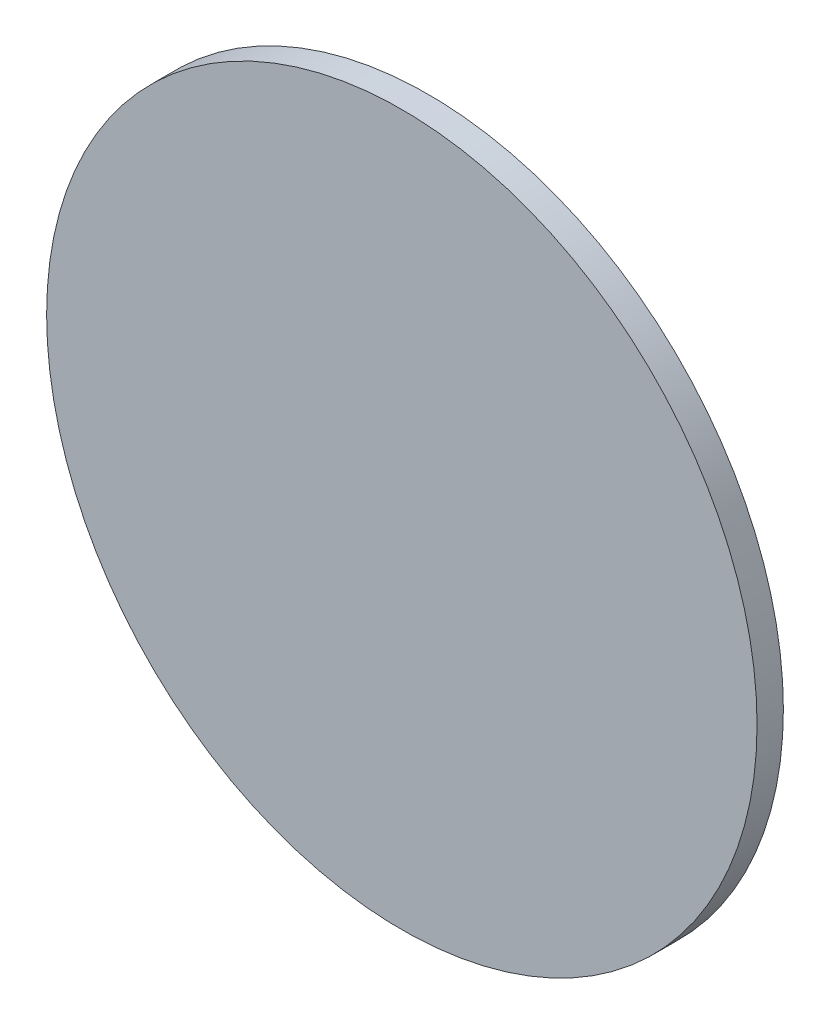
ISO-10303-21;
HEADER;
FILE_DESCRIPTION(('STEP AP214'),'2;1');
FILE_NAME('part.step','',(''),(''),'','','');
FILE_SCHEMA(('AUTOMOTIVE_DESIGN { 1 0 10303 214 1 1 1 1 }'));
ENDSEC;
DATA;
#1=APPLICATION_CONTEXT('core data for automotive mechanical design processes');
#2=APPLICATION_PROTOCOL_DEFINITION('international standard','automotive_design',2000,#1);
#3=PRODUCT_CONTEXT('',#1,'mechanical');
#4=PRODUCT('Part','Part','',(#3));
#5=PRODUCT_RELATED_PRODUCT_CATEGORY('part','',(#4));
#6=PRODUCT_DEFINITION_FORMATION('','',#4);
#7=PRODUCT_DEFINITION_CONTEXT('part definition',#1,'design');
#8=PRODUCT_DEFINITION('design','',#6,#7);
#9=PRODUCT_DEFINITION_SHAPE('','',#8);
#10=(LENGTH_UNIT() NAMED_UNIT(*) SI_UNIT(.MILLI.,.METRE.));
#11=(NAMED_UNIT(*) PLANE_ANGLE_UNIT() SI_UNIT($,.RADIAN.));
#12=(NAMED_UNIT(*) SI_UNIT($,.STERADIAN.) SOLID_ANGLE_UNIT());
#13=UNCERTAINTY_MEASURE_WITH_UNIT(LENGTH_MEASURE(1.E-05),#10,'distance_accuracy_value','');
#14=(GEOMETRIC_REPRESENTATION_CONTEXT(3) GLOBAL_UNCERTAINTY_ASSIGNED_CONTEXT((#13)) GLOBAL_UNIT_ASSIGNED_CONTEXT((#10,
#11,#12)) REPRESENTATION_CONTEXT('',''));
#15=CARTESIAN_POINT('',(0.,0.,0.));
#16=DIRECTION('',(0.,0.,1.));
#17=DIRECTION('',(1.,0.,0.));
#18=AXIS2_PLACEMENT_3D('',#15,#16,#17);
#19=CARTESIAN_POINT('',(0.,0.,5.));
#20=DIRECTION('',(0.,0.,-1.));
#21=DIRECTION('',(-1.,0.,0.));
#22=AXIS2_PLACEMENT_3D('',#19,#20,#21);
#23=CYLINDRICAL_SURFACE('',#22,67.5);
#24=CARTESIAN_POINT('',(0.,0.,5.));
#25=DIRECTION('',(0.,0.,1.));
#26=DIRECTION('',(1.,0.,0.));
#27=AXIS2_PLACEMENT_3D('',#24,#25,#26);
#28=CIRCLE('',#27,67.5);
#29=CARTESIAN_POINT('',(67.5,0.,5.));
#30=VERTEX_POINT('',#29);
#31=EDGE_CURVE('E10',#30,#30,#28,.T.);
#32=ORIENTED_EDGE('',*,*,#31,.F.);
#33=EDGE_LOOP('',(#32));
#34=FACE_BOUND('',#33,.T.);
#35=CARTESIAN_POINT('',(0.,0.,0.));
#36=DIRECTION('',(0.,0.,1.));
#37=DIRECTION('',(1.,0.,0.));
#38=AXIS2_PLACEMENT_3D('',#35,#36,#37);
#39=CIRCLE('',#38,67.5);
#40=CARTESIAN_POINT('',(67.5,0.,0.));
#41=VERTEX_POINT('',#40);
#42=EDGE_CURVE('E36',#41,#41,#39,.T.);
#43=ORIENTED_EDGE('',*,*,#42,.T.);
#44=EDGE_LOOP('',(#43));
#45=FACE_BOUND('',#44,.T.);
#46=ADVANCED_FACE('F33',(#34,#45),#23,.T.);
#47=CARTESIAN_POINT('',(0.,0.,5.));
#48=DIRECTION('',(0.,0.,1.));
#49=DIRECTION('',(1.,0.,0.));
#50=AXIS2_PLACEMENT_3D('',#47,#48,#49);
#51=PLANE('',#50);
#52=ORIENTED_EDGE('',*,*,#31,.T.);
#53=EDGE_LOOP('',(#52));
#54=FACE_BOUND('',#53,.T.);
#55=ADVANCED_FACE('F48',(#54),#51,.T.);
#56=CARTESIAN_POINT('',(0.,0.,0.));
#57=DIRECTION('',(0.,0.,1.));
#58=DIRECTION('',(1.,0.,0.));
#59=AXIS2_PLACEMENT_3D('',#56,#57,#58);
#60=PLANE('',#59);
#61=ORIENTED_EDGE('',*,*,#42,.F.);
#62=EDGE_LOOP('',(#61));
#63=FACE_BOUND('',#62,.T.);
#64=ADVANCED_FACE('F46',(#63),#60,.F.);
#65=CLOSED_SHELL('',(#46,#55,#64));
#66=MANIFOLD_SOLID_BREP('B2',#65);
#67=ADVANCED_BREP_SHAPE_REPRESENTATION('',(#18,#66),#14);
#68=SHAPE_DEFINITION_REPRESENTATION(#9,#67);
ENDSEC;
END-ISO-10303-21;
